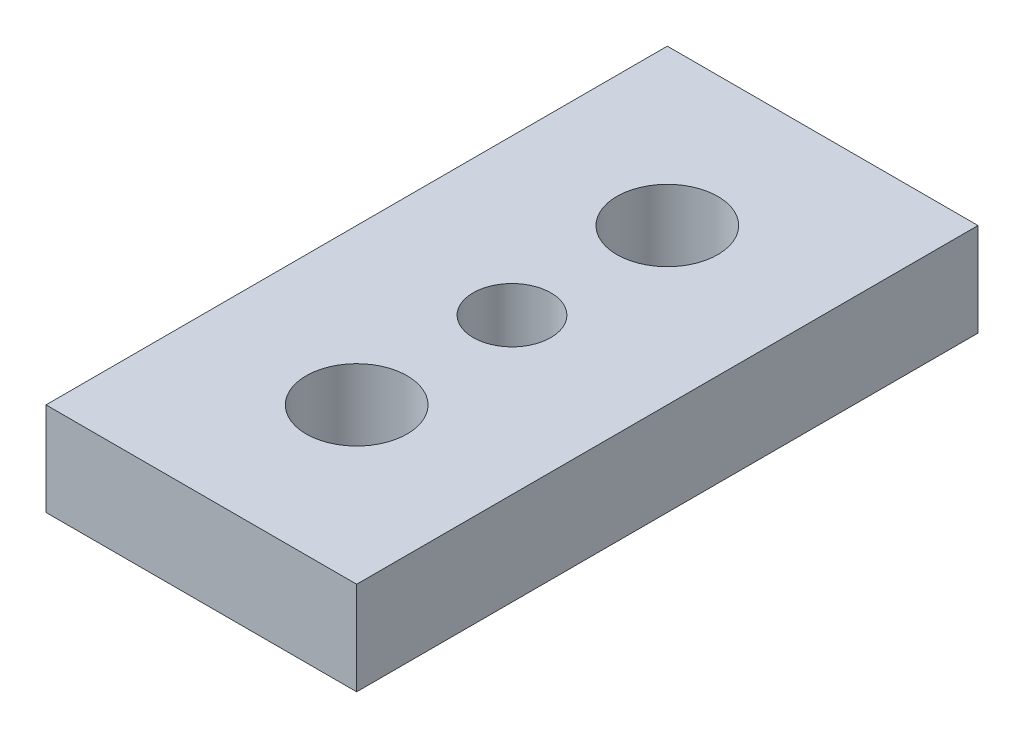
ISO-10303-21;
HEADER;
FILE_DESCRIPTION(('STEP AP214'),'2;1');
FILE_NAME('part.step','',(''),(''),'','','');
FILE_SCHEMA(('AUTOMOTIVE_DESIGN { 1 0 10303 214 1 1 1 1 }'));
ENDSEC;
DATA;
#1=APPLICATION_CONTEXT('core data for automotive mechanical design processes');
#2=APPLICATION_PROTOCOL_DEFINITION('international standard','automotive_design',2000,#1);
#3=PRODUCT_CONTEXT('',#1,'mechanical');
#4=PRODUCT('Part','Part','',(#3));
#5=PRODUCT_RELATED_PRODUCT_CATEGORY('part','',(#4));
#6=PRODUCT_DEFINITION_FORMATION('','',#4);
#7=PRODUCT_DEFINITION_CONTEXT('part definition',#1,'design');
#8=PRODUCT_DEFINITION('design','',#6,#7);
#9=PRODUCT_DEFINITION_SHAPE('','',#8);
#10=(LENGTH_UNIT() NAMED_UNIT(*) SI_UNIT(.MILLI.,.METRE.));
#11=(NAMED_UNIT(*) PLANE_ANGLE_UNIT() SI_UNIT($,.RADIAN.));
#12=(NAMED_UNIT(*) SI_UNIT($,.STERADIAN.) SOLID_ANGLE_UNIT());
#13=UNCERTAINTY_MEASURE_WITH_UNIT(LENGTH_MEASURE(1.E-05),#10,'distance_accuracy_value','');
#14=(GEOMETRIC_REPRESENTATION_CONTEXT(3) GLOBAL_UNCERTAINTY_ASSIGNED_CONTEXT((#13)) GLOBAL_UNIT_ASSIGNED_CONTEXT((#10,
#11,#12)) REPRESENTATION_CONTEXT('',''));
#15=CARTESIAN_POINT('',(0.,0.,0.));
#16=DIRECTION('',(0.,0.,1.));
#17=DIRECTION('',(1.,0.,0.));
#18=AXIS2_PLACEMENT_3D('',#15,#16,#17);
#19=CARTESIAN_POINT('',(0.,6.,0.));
#20=DIRECTION('',(0.,-1.,0.));
#21=DIRECTION('',(0.,0.,-1.));
#22=AXIS2_PLACEMENT_3D('',#19,#20,#21);
#23=PLANE('',#22);
#24=CARTESIAN_POINT('',(10.,6.,-20.));
#25=DIRECTION('',(0.,1.,0.));
#26=DIRECTION('',(0.,0.,1.));
#27=AXIS2_PLACEMENT_3D('',#24,#25,#26);
#28=CIRCLE('',#27,2.49999999999999);
#29=CARTESIAN_POINT('',(10.,6.,-17.5));
#30=VERTEX_POINT('',#29);
#31=EDGE_CURVE('E128',#30,#30,#28,.T.);
#32=ORIENTED_EDGE('',*,*,#31,.F.);
#33=EDGE_LOOP('',(#32));
#34=FACE_BOUND('',#33,.T.);
#35=CARTESIAN_POINT('',(10.,6.,-30.));
#36=DIRECTION('',(0.,1.,0.));
#37=DIRECTION('',(0.,0.,1.));
#38=AXIS2_PLACEMENT_3D('',#35,#36,#37);
#39=CIRCLE('',#38,3.25);
#40=CARTESIAN_POINT('',(10.,6.,-26.75));
#41=VERTEX_POINT('',#40);
#42=EDGE_CURVE('E102',#41,#41,#39,.T.);
#43=ORIENTED_EDGE('',*,*,#42,.F.);
#44=EDGE_LOOP('',(#43));
#45=FACE_BOUND('',#44,.T.);
#46=DIRECTION('',(-1.,0.,0.));
#47=VECTOR('',#46,1.);
#48=CARTESIAN_POINT('',(0.,6.,-40.));
#49=LINE('',#48,#47);
#50=CARTESIAN_POINT('',(20.,6.,-40.));
#51=VERTEX_POINT('',#50);
#52=CARTESIAN_POINT('',(0.,6.,-40.));
#53=VERTEX_POINT('',#52);
#54=EDGE_CURVE('E87',#51,#53,#49,.T.);
#55=ORIENTED_EDGE('',*,*,#54,.T.);
#56=DIRECTION('',(0.,0.,1.));
#57=VECTOR('',#56,1.);
#58=CARTESIAN_POINT('',(0.,6.,-40.));
#59=LINE('',#58,#57);
#60=CARTESIAN_POINT('',(0.,6.,0.));
#61=VERTEX_POINT('',#60);
#62=EDGE_CURVE('E82',#53,#61,#59,.T.);
#63=ORIENTED_EDGE('',*,*,#62,.T.);
#64=DIRECTION('',(1.,0.,0.));
#65=VECTOR('',#64,1.);
#66=CARTESIAN_POINT('',(0.,6.,0.));
#67=LINE('',#66,#65);
#68=CARTESIAN_POINT('',(20.,6.,0.));
#69=VERTEX_POINT('',#68);
#70=EDGE_CURVE('E85',#61,#69,#67,.T.);
#71=ORIENTED_EDGE('',*,*,#70,.T.);
#72=DIRECTION('',(0.,0.,-1.));
#73=VECTOR('',#72,1.);
#74=CARTESIAN_POINT('',(20.,6.,-40.));
#75=LINE('',#74,#73);
#76=EDGE_CURVE('E52',#69,#51,#75,.T.);
#77=ORIENTED_EDGE('',*,*,#76,.T.);
#78=EDGE_LOOP('',(#55,#63,#71,#77));
#79=FACE_BOUND('',#78,.T.);
#80=CARTESIAN_POINT('',(10.,6.,-10.));
#81=DIRECTION('',(0.,1.,0.));
#82=DIRECTION('',(0.,0.,1.));
#83=AXIS2_PLACEMENT_3D('',#80,#81,#82);
#84=CIRCLE('',#83,3.25);
#85=CARTESIAN_POINT('',(10.,6.,-6.75));
#86=VERTEX_POINT('',#85);
#87=EDGE_CURVE('E117',#86,#86,#84,.T.);
#88=ORIENTED_EDGE('',*,*,#87,.F.);
#89=EDGE_LOOP('',(#88));
#90=FACE_BOUND('',#89,.T.);
#91=ADVANCED_FACE('F35',(#34,#45,#79,#90),#23,.F.);
#92=CARTESIAN_POINT('',(0.,0.,0.));
#93=DIRECTION('',(0.,-1.,0.));
#94=DIRECTION('',(0.,0.,-1.));
#95=AXIS2_PLACEMENT_3D('',#92,#93,#94);
#96=PLANE('',#95);
#97=CARTESIAN_POINT('',(10.,0.,-20.));
#98=DIRECTION('',(0.,1.,0.));
#99=DIRECTION('',(0.,0.,1.));
#100=AXIS2_PLACEMENT_3D('',#97,#98,#99);
#101=CIRCLE('',#100,2.5);
#102=CARTESIAN_POINT('',(10.,0.,-17.5));
#103=VERTEX_POINT('',#102);
#104=EDGE_CURVE('E123',#103,#103,#101,.T.);
#105=ORIENTED_EDGE('',*,*,#104,.T.);
#106=EDGE_LOOP('',(#105));
#107=FACE_BOUND('',#106,.T.);
#108=CARTESIAN_POINT('',(10.,0.,-30.));
#109=DIRECTION('',(0.,1.,0.));
#110=DIRECTION('',(0.,0.,1.));
#111=AXIS2_PLACEMENT_3D('',#108,#109,#110);
#112=CIRCLE('',#111,3.25);
#113=CARTESIAN_POINT('',(10.,0.,-26.75));
#114=VERTEX_POINT('',#113);
#115=EDGE_CURVE('E114',#114,#114,#112,.T.);
#116=ORIENTED_EDGE('',*,*,#115,.T.);
#117=EDGE_LOOP('',(#116));
#118=FACE_BOUND('',#117,.T.);
#119=DIRECTION('',(-1.,0.,0.));
#120=VECTOR('',#119,1.);
#121=CARTESIAN_POINT('',(0.,0.,-40.));
#122=LINE('',#121,#120);
#123=CARTESIAN_POINT('',(20.,0.,-40.));
#124=VERTEX_POINT('',#123);
#125=CARTESIAN_POINT('',(0.,0.,-40.));
#126=VERTEX_POINT('',#125);
#127=EDGE_CURVE('E99',#124,#126,#122,.T.);
#128=ORIENTED_EDGE('',*,*,#127,.F.);
#129=DIRECTION('',(0.,0.,-1.));
#130=VECTOR('',#129,1.);
#131=CARTESIAN_POINT('',(20.,0.,-40.));
#132=LINE('',#131,#130);
#133=CARTESIAN_POINT('',(20.,0.,0.));
#134=VERTEX_POINT('',#133);
#135=EDGE_CURVE('E75',#134,#124,#132,.T.);
#136=ORIENTED_EDGE('',*,*,#135,.F.);
#137=DIRECTION('',(1.,0.,0.));
#138=VECTOR('',#137,1.);
#139=CARTESIAN_POINT('',(0.,0.,0.));
#140=LINE('',#139,#138);
#141=CARTESIAN_POINT('',(0.,0.,0.));
#142=VERTEX_POINT('',#141);
#143=EDGE_CURVE('E69',#142,#134,#140,.T.);
#144=ORIENTED_EDGE('',*,*,#143,.F.);
#145=DIRECTION('',(0.,0.,1.));
#146=VECTOR('',#145,1.);
#147=CARTESIAN_POINT('',(0.,0.,-40.));
#148=LINE('',#147,#146);
#149=EDGE_CURVE('E91',#126,#142,#148,.T.);
#150=ORIENTED_EDGE('',*,*,#149,.F.);
#151=EDGE_LOOP('',(#128,#136,#144,#150));
#152=FACE_BOUND('',#151,.T.);
#153=CARTESIAN_POINT('',(10.,0.,-10.));
#154=DIRECTION('',(0.,1.,0.));
#155=DIRECTION('',(0.,0.,1.));
#156=AXIS2_PLACEMENT_3D('',#153,#154,#155);
#157=CIRCLE('',#156,3.25);
#158=CARTESIAN_POINT('',(10.,0.,-6.75));
#159=VERTEX_POINT('',#158);
#160=EDGE_CURVE('E120',#159,#159,#157,.T.);
#161=ORIENTED_EDGE('',*,*,#160,.T.);
#162=EDGE_LOOP('',(#161));
#163=FACE_BOUND('',#162,.T.);
#164=ADVANCED_FACE('F110',(#107,#118,#152,#163),#96,.T.);
#165=CARTESIAN_POINT('',(0.,6.,-40.));
#166=DIRECTION('',(0.,0.,1.));
#167=DIRECTION('',(1.,0.,0.));
#168=AXIS2_PLACEMENT_3D('',#165,#166,#167);
#169=PLANE('',#168);
#170=ORIENTED_EDGE('',*,*,#127,.T.);
#171=DIRECTION('',(0.,-1.,0.));
#172=VECTOR('',#171,1.);
#173=CARTESIAN_POINT('',(0.,6.,-40.));
#174=LINE('',#173,#172);
#175=EDGE_CURVE('E11',#53,#126,#174,.T.);
#176=ORIENTED_EDGE('',*,*,#175,.F.);
#177=ORIENTED_EDGE('',*,*,#54,.F.);
#178=DIRECTION('',(0.,-1.,0.));
#179=VECTOR('',#178,1.);
#180=CARTESIAN_POINT('',(20.,6.,-40.));
#181=LINE('',#180,#179);
#182=EDGE_CURVE('E95',#51,#124,#181,.T.);
#183=ORIENTED_EDGE('',*,*,#182,.T.);
#184=EDGE_LOOP('',(#170,#176,#177,#183));
#185=FACE_BOUND('',#184,.T.);
#186=ADVANCED_FACE('F37',(#185),#169,.F.);
#187=CARTESIAN_POINT('',(0.,6.,-40.));
#188=DIRECTION('',(1.,0.,0.));
#189=DIRECTION('',(0.,0.,-1.));
#190=AXIS2_PLACEMENT_3D('',#187,#188,#189);
#191=PLANE('',#190);
#192=ORIENTED_EDGE('',*,*,#149,.T.);
#193=DIRECTION('',(0.,-1.,0.));
#194=VECTOR('',#193,1.);
#195=CARTESIAN_POINT('',(0.,6.,0.));
#196=LINE('',#195,#194);
#197=EDGE_CURVE('E44',#61,#142,#196,.T.);
#198=ORIENTED_EDGE('',*,*,#197,.F.);
#199=ORIENTED_EDGE('',*,*,#62,.F.);
#200=ORIENTED_EDGE('',*,*,#175,.T.);
#201=EDGE_LOOP('',(#192,#198,#199,#200));
#202=FACE_BOUND('',#201,.T.);
#203=ADVANCED_FACE('F90',(#202),#191,.F.);
#204=CARTESIAN_POINT('',(0.,6.,0.));
#205=DIRECTION('',(0.,0.,-1.));
#206=DIRECTION('',(-1.,0.,0.));
#207=AXIS2_PLACEMENT_3D('',#204,#205,#206);
#208=PLANE('',#207);
#209=ORIENTED_EDGE('',*,*,#143,.T.);
#210=DIRECTION('',(0.,-1.,0.));
#211=VECTOR('',#210,1.);
#212=CARTESIAN_POINT('',(20.,6.,0.));
#213=LINE('',#212,#211);
#214=EDGE_CURVE('E92',#69,#134,#213,.T.);
#215=ORIENTED_EDGE('',*,*,#214,.F.);
#216=ORIENTED_EDGE('',*,*,#70,.F.);
#217=ORIENTED_EDGE('',*,*,#197,.T.);
#218=EDGE_LOOP('',(#209,#215,#216,#217));
#219=FACE_BOUND('',#218,.T.);
#220=ADVANCED_FACE('F93',(#219),#208,.F.);
#221=CARTESIAN_POINT('',(20.,6.,-40.));
#222=DIRECTION('',(-1.,0.,0.));
#223=DIRECTION('',(0.,0.,1.));
#224=AXIS2_PLACEMENT_3D('',#221,#222,#223);
#225=PLANE('',#224);
#226=ORIENTED_EDGE('',*,*,#135,.T.);
#227=ORIENTED_EDGE('',*,*,#182,.F.);
#228=ORIENTED_EDGE('',*,*,#76,.F.);
#229=ORIENTED_EDGE('',*,*,#214,.T.);
#230=EDGE_LOOP('',(#226,#227,#228,#229));
#231=FACE_BOUND('',#230,.T.);
#232=ADVANCED_FACE('F107',(#231),#225,.F.);
#233=CARTESIAN_POINT('',(10.,6.,-30.));
#234=DIRECTION('',(0.,-1.,0.));
#235=DIRECTION('',(0.,0.,-1.));
#236=AXIS2_PLACEMENT_3D('',#233,#234,#235);
#237=CYLINDRICAL_SURFACE('',#236,3.25);
#238=ORIENTED_EDGE('',*,*,#42,.T.);
#239=EDGE_LOOP('',(#238));
#240=FACE_BOUND('',#239,.T.);
#241=ORIENTED_EDGE('',*,*,#115,.F.);
#242=EDGE_LOOP('',(#241));
#243=FACE_BOUND('',#242,.T.);
#244=ADVANCED_FACE('F139',(#240,#243),#237,.F.);
#245=CARTESIAN_POINT('',(10.,6.,-10.));
#246=DIRECTION('',(0.,-1.,0.));
#247=DIRECTION('',(0.,0.,-1.));
#248=AXIS2_PLACEMENT_3D('',#245,#246,#247);
#249=CYLINDRICAL_SURFACE('',#248,3.25);
#250=ORIENTED_EDGE('',*,*,#87,.T.);
#251=EDGE_LOOP('',(#250));
#252=FACE_BOUND('',#251,.T.);
#253=ORIENTED_EDGE('',*,*,#160,.F.);
#254=EDGE_LOOP('',(#253));
#255=FACE_BOUND('',#254,.T.);
#256=ADVANCED_FACE('F142',(#252,#255),#249,.F.);
#257=CARTESIAN_POINT('',(10.,6.,-20.));
#258=DIRECTION('',(0.,1.,0.));
#259=DIRECTION('',(0.,0.,1.));
#260=AXIS2_PLACEMENT_3D('',#257,#258,#259);
#261=CYLINDRICAL_SURFACE('',#260,2.49999999999999);
#262=ORIENTED_EDGE('',*,*,#104,.F.);
#263=EDGE_LOOP('',(#262));
#264=FACE_BOUND('',#263,.T.);
#265=ORIENTED_EDGE('',*,*,#31,.T.);
#266=EDGE_LOOP('',(#265));
#267=FACE_BOUND('',#266,.T.);
#268=ADVANCED_FACE('F132',(#264,#267),#261,.F.);
#269=CLOSED_SHELL('',(#91,#164,#186,#203,#220,#232,#244,#256,#268));
#270=MANIFOLD_SOLID_BREP('B2',#269);
#271=ADVANCED_BREP_SHAPE_REPRESENTATION('',(#18,#270),#14);
#272=SHAPE_DEFINITION_REPRESENTATION(#9,#271);
ENDSEC;
END-ISO-10303-21;
